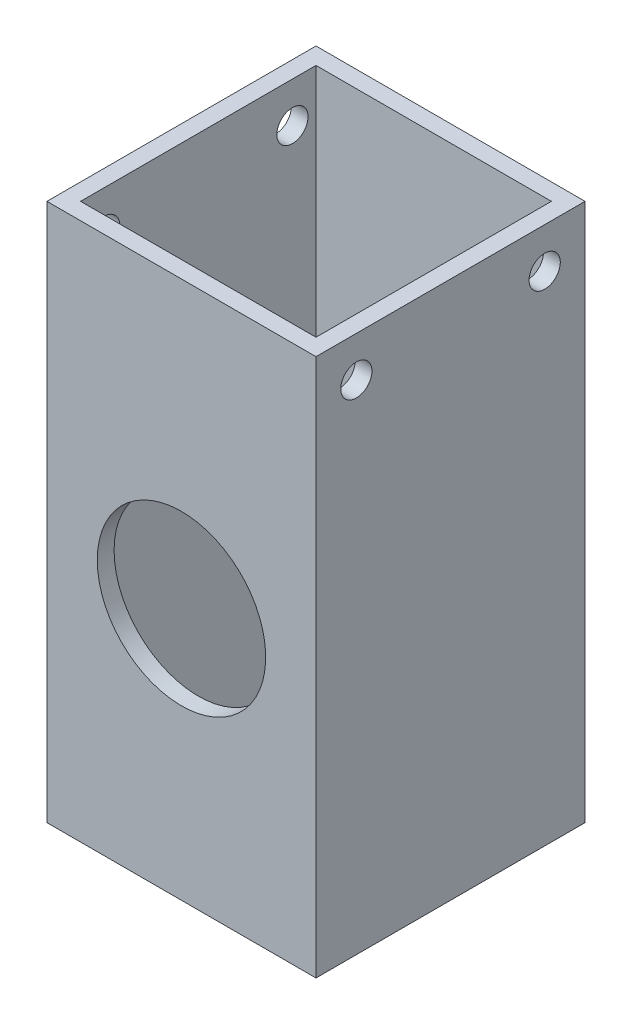
ISO-10303-21;
HEADER;
FILE_DESCRIPTION(('STEP AP214'),'2;1');
FILE_NAME('part.step','',(''),(''),'','','');
FILE_SCHEMA(('AUTOMOTIVE_DESIGN { 1 0 10303 214 1 1 1 1 }'));
ENDSEC;
DATA;
#1=APPLICATION_CONTEXT('core data for automotive mechanical design processes');
#2=APPLICATION_PROTOCOL_DEFINITION('international standard','automotive_design',2000,#1);
#3=PRODUCT_CONTEXT('',#1,'mechanical');
#4=PRODUCT('Part','Part','',(#3));
#5=PRODUCT_RELATED_PRODUCT_CATEGORY('part','',(#4));
#6=PRODUCT_DEFINITION_FORMATION('','',#4);
#7=PRODUCT_DEFINITION_CONTEXT('part definition',#1,'design');
#8=PRODUCT_DEFINITION('design','',#6,#7);
#9=PRODUCT_DEFINITION_SHAPE('','',#8);
#10=(LENGTH_UNIT() NAMED_UNIT(*) SI_UNIT(.MILLI.,.METRE.));
#11=(NAMED_UNIT(*) PLANE_ANGLE_UNIT() SI_UNIT($,.RADIAN.));
#12=(NAMED_UNIT(*) SI_UNIT($,.STERADIAN.) SOLID_ANGLE_UNIT());
#13=UNCERTAINTY_MEASURE_WITH_UNIT(LENGTH_MEASURE(1.E-05),#10,'distance_accuracy_value','');
#14=(GEOMETRIC_REPRESENTATION_CONTEXT(3) GLOBAL_UNCERTAINTY_ASSIGNED_CONTEXT((#13)) GLOBAL_UNIT_ASSIGNED_CONTEXT((#10,
#11,#12)) REPRESENTATION_CONTEXT('',''));
#15=CARTESIAN_POINT('',(0.,0.,0.));
#16=DIRECTION('',(0.,0.,1.));
#17=DIRECTION('',(1.,0.,0.));
#18=AXIS2_PLACEMENT_3D('',#15,#16,#17);
#19=CARTESIAN_POINT('',(0.,50.8,0.));
#20=DIRECTION('',(0.,1.,0.));
#21=DIRECTION('',(0.,0.,1.));
#22=AXIS2_PLACEMENT_3D('',#19,#20,#21);
#23=PLANE('',#22);
#24=DIRECTION('',(0.,0.,-1.));
#25=VECTOR('',#24,1.);
#26=CARTESIAN_POINT('',(12.7,50.8,12.7));
#27=LINE('',#26,#25);
#28=CARTESIAN_POINT('',(12.7,50.8,12.7));
#29=VERTEX_POINT('',#28);
#30=CARTESIAN_POINT('',(12.7,50.8,-12.7));
#31=VERTEX_POINT('',#30);
#32=EDGE_CURVE('E144',#29,#31,#27,.T.);
#33=ORIENTED_EDGE('',*,*,#32,.T.);
#34=DIRECTION('',(-1.,0.,0.));
#35=VECTOR('',#34,1.);
#36=CARTESIAN_POINT('',(12.7,50.8,-12.7));
#37=LINE('',#36,#35);
#38=CARTESIAN_POINT('',(-12.7,50.8,-12.7));
#39=VERTEX_POINT('',#38);
#40=EDGE_CURVE('E147',#31,#39,#37,.T.);
#41=ORIENTED_EDGE('',*,*,#40,.T.);
#42=DIRECTION('',(0.,0.,1.));
#43=VECTOR('',#42,1.);
#44=CARTESIAN_POINT('',(-12.7,50.8,-12.7));
#45=LINE('',#44,#43);
#46=CARTESIAN_POINT('',(-12.7,50.8,12.7));
#47=VERTEX_POINT('',#46);
#48=EDGE_CURVE('E150',#39,#47,#45,.T.);
#49=ORIENTED_EDGE('',*,*,#48,.T.);
#50=DIRECTION('',(1.,0.,0.));
#51=VECTOR('',#50,1.);
#52=CARTESIAN_POINT('',(-12.7,50.8,12.7));
#53=LINE('',#52,#51);
#54=EDGE_CURVE('E152',#47,#29,#53,.T.);
#55=ORIENTED_EDGE('',*,*,#54,.T.);
#56=EDGE_LOOP('',(#33,#41,#49,#55));
#57=FACE_BOUND('',#56,.T.);
#58=DIRECTION('',(-1.,0.,0.));
#59=VECTOR('',#58,1.);
#60=CARTESIAN_POINT('',(11.1125,50.8,-11.1125));
#61=LINE('',#60,#59);
#62=CARTESIAN_POINT('',(11.1125,50.8,-11.1125));
#63=VERTEX_POINT('',#62);
#64=CARTESIAN_POINT('',(-11.1125,50.8,-11.1125));
#65=VERTEX_POINT('',#64);
#66=EDGE_CURVE('E114',#63,#65,#61,.T.);
#67=ORIENTED_EDGE('',*,*,#66,.F.);
#68=DIRECTION('',(0.,0.,-1.));
#69=VECTOR('',#68,1.);
#70=CARTESIAN_POINT('',(11.1125,50.8,11.1125));
#71=LINE('',#70,#69);
#72=CARTESIAN_POINT('',(11.1125,50.8,11.1125));
#73=VERTEX_POINT('',#72);
#74=EDGE_CURVE('E106',#73,#63,#71,.T.);
#75=ORIENTED_EDGE('',*,*,#74,.F.);
#76=DIRECTION('',(1.,0.,0.));
#77=VECTOR('',#76,1.);
#78=CARTESIAN_POINT('',(-11.1125,50.8,11.1125));
#79=LINE('',#78,#77);
#80=CARTESIAN_POINT('',(-11.1125,50.8,11.1125));
#81=VERTEX_POINT('',#80);
#82=EDGE_CURVE('E128',#81,#73,#79,.T.);
#83=ORIENTED_EDGE('',*,*,#82,.F.);
#84=DIRECTION('',(0.,0.,1.));
#85=VECTOR('',#84,1.);
#86=CARTESIAN_POINT('',(-11.1125,50.8,-11.1125));
#87=LINE('',#86,#85);
#88=EDGE_CURVE('E126',#65,#81,#87,.T.);
#89=ORIENTED_EDGE('',*,*,#88,.F.);
#90=EDGE_LOOP('',(#67,#75,#83,#89));
#91=FACE_BOUND('',#90,.T.);
#92=ADVANCED_FACE('F39',(#57,#91),#23,.T.);
#93=CARTESIAN_POINT('',(0.,0.,0.));
#94=DIRECTION('',(0.,1.,0.));
#95=DIRECTION('',(0.,0.,1.));
#96=AXIS2_PLACEMENT_3D('',#93,#94,#95);
#97=PLANE('',#96);
#98=DIRECTION('',(0.,0.,-1.));
#99=VECTOR('',#98,1.);
#100=CARTESIAN_POINT('',(12.7,0.,12.7));
#101=LINE('',#100,#99);
#102=CARTESIAN_POINT('',(12.7,0.,12.7));
#103=VERTEX_POINT('',#102);
#104=CARTESIAN_POINT('',(12.7,0.,-12.7));
#105=VERTEX_POINT('',#104);
#106=EDGE_CURVE('E122',#103,#105,#101,.T.);
#107=ORIENTED_EDGE('',*,*,#106,.F.);
#108=DIRECTION('',(1.,0.,0.));
#109=VECTOR('',#108,1.);
#110=CARTESIAN_POINT('',(-12.7,0.,12.7));
#111=LINE('',#110,#109);
#112=CARTESIAN_POINT('',(-12.7,0.,12.7));
#113=VERTEX_POINT('',#112);
#114=EDGE_CURVE('E148',#113,#103,#111,.T.);
#115=ORIENTED_EDGE('',*,*,#114,.F.);
#116=DIRECTION('',(0.,0.,1.));
#117=VECTOR('',#116,1.);
#118=CARTESIAN_POINT('',(-12.7,0.,-12.7));
#119=LINE('',#118,#117);
#120=CARTESIAN_POINT('',(-12.7,0.,-12.7));
#121=VERTEX_POINT('',#120);
#122=EDGE_CURVE('E159',#121,#113,#119,.T.);
#123=ORIENTED_EDGE('',*,*,#122,.F.);
#124=DIRECTION('',(-1.,0.,0.));
#125=VECTOR('',#124,1.);
#126=CARTESIAN_POINT('',(12.7,0.,-12.7));
#127=LINE('',#126,#125);
#128=EDGE_CURVE('E157',#105,#121,#127,.T.);
#129=ORIENTED_EDGE('',*,*,#128,.F.);
#130=EDGE_LOOP('',(#107,#115,#123,#129));
#131=FACE_BOUND('',#130,.T.);
#132=DIRECTION('',(0.,0.,-1.));
#133=VECTOR('',#132,1.);
#134=CARTESIAN_POINT('',(11.1125,0.,11.1125));
#135=LINE('',#134,#133);
#136=CARTESIAN_POINT('',(11.1125,0.,11.1125));
#137=VERTEX_POINT('',#136);
#138=CARTESIAN_POINT('',(11.1125,0.,-11.1125));
#139=VERTEX_POINT('',#138);
#140=EDGE_CURVE('E64',#137,#139,#135,.T.);
#141=ORIENTED_EDGE('',*,*,#140,.T.);
#142=DIRECTION('',(-1.,0.,0.));
#143=VECTOR('',#142,1.);
#144=CARTESIAN_POINT('',(11.1125,0.,-11.1125));
#145=LINE('',#144,#143);
#146=CARTESIAN_POINT('',(-11.1125,0.,-11.1125));
#147=VERTEX_POINT('',#146);
#148=EDGE_CURVE('E121',#139,#147,#145,.T.);
#149=ORIENTED_EDGE('',*,*,#148,.T.);
#150=DIRECTION('',(0.,0.,1.));
#151=VECTOR('',#150,1.);
#152=CARTESIAN_POINT('',(-11.1125,0.,-11.1125));
#153=LINE('',#152,#151);
#154=CARTESIAN_POINT('',(-11.1125,0.,11.1125));
#155=VERTEX_POINT('',#154);
#156=EDGE_CURVE('E136',#147,#155,#153,.T.);
#157=ORIENTED_EDGE('',*,*,#156,.T.);
#158=DIRECTION('',(1.,0.,0.));
#159=VECTOR('',#158,1.);
#160=CARTESIAN_POINT('',(-11.1125,0.,11.1125));
#161=LINE('',#160,#159);
#162=EDGE_CURVE('E115',#155,#137,#161,.T.);
#163=ORIENTED_EDGE('',*,*,#162,.T.);
#164=EDGE_LOOP('',(#141,#149,#157,#163));
#165=FACE_BOUND('',#164,.T.);
#166=ADVANCED_FACE('F224',(#131,#165),#97,.F.);
#167=CARTESIAN_POINT('',(12.7,50.8,12.7));
#168=DIRECTION('',(-1.,0.,0.));
#169=DIRECTION('',(0.,0.,1.));
#170=AXIS2_PLACEMENT_3D('',#167,#168,#169);
#171=PLANE('',#170);
#172=CARTESIAN_POINT('',(12.7,46.99,8.89));
#173=DIRECTION('',(-1.,0.,0.));
#174=DIRECTION('',(0.,0.,1.));
#175=AXIS2_PLACEMENT_3D('',#172,#173,#174);
#176=CIRCLE('',#175,1.4732);
#177=CARTESIAN_POINT('',(12.7,46.99,10.3632));
#178=VERTEX_POINT('',#177);
#179=EDGE_CURVE('E195',#178,#178,#176,.T.);
#180=ORIENTED_EDGE('',*,*,#179,.T.);
#181=EDGE_LOOP('',(#180));
#182=FACE_BOUND('',#181,.T.);
#183=CARTESIAN_POINT('',(12.7,46.99,-8.89000000000001));
#184=DIRECTION('',(-1.,0.,0.));
#185=DIRECTION('',(0.,0.,1.));
#186=AXIS2_PLACEMENT_3D('',#183,#184,#185);
#187=CIRCLE('',#186,1.4732);
#188=CARTESIAN_POINT('',(12.7,46.99,-7.41680000000001));
#189=VERTEX_POINT('',#188);
#190=EDGE_CURVE('E180',#189,#189,#187,.T.);
#191=ORIENTED_EDGE('',*,*,#190,.T.);
#192=EDGE_LOOP('',(#191));
#193=FACE_BOUND('',#192,.T.);
#194=ORIENTED_EDGE('',*,*,#106,.T.);
#195=DIRECTION('',(0.,-1.,0.));
#196=VECTOR('',#195,1.);
#197=CARTESIAN_POINT('',(12.7,50.8,-12.7));
#198=LINE('',#197,#196);
#199=EDGE_CURVE('E11',#31,#105,#198,.T.);
#200=ORIENTED_EDGE('',*,*,#199,.F.);
#201=ORIENTED_EDGE('',*,*,#32,.F.);
#202=DIRECTION('',(0.,-1.,0.));
#203=VECTOR('',#202,1.);
#204=CARTESIAN_POINT('',(12.7,50.8,12.7));
#205=LINE('',#204,#203);
#206=EDGE_CURVE('E154',#29,#103,#205,.T.);
#207=ORIENTED_EDGE('',*,*,#206,.T.);
#208=EDGE_LOOP('',(#194,#200,#201,#207));
#209=FACE_BOUND('',#208,.T.);
#210=ADVANCED_FACE('F41',(#182,#193,#209),#171,.F.);
#211=CARTESIAN_POINT('',(12.7,50.8,-12.7));
#212=DIRECTION('',(0.,0.,1.));
#213=DIRECTION('',(1.,0.,0.));
#214=AXIS2_PLACEMENT_3D('',#211,#212,#213);
#215=PLANE('',#214);
#216=CARTESIAN_POINT('',(0.,23.8506,-12.7));
#217=DIRECTION('',(0.,0.,1.));
#218=DIRECTION('',(1.,0.,0.));
#219=AXIS2_PLACEMENT_3D('',#216,#217,#218);
#220=CIRCLE('',#219,7.9502);
#221=CARTESIAN_POINT('',(7.9502,23.8506,-12.7));
#222=VERTEX_POINT('',#221);
#223=EDGE_CURVE('E172',#222,#222,#220,.T.);
#224=ORIENTED_EDGE('',*,*,#223,.T.);
#225=EDGE_LOOP('',(#224));
#226=FACE_BOUND('',#225,.T.);
#227=ORIENTED_EDGE('',*,*,#128,.T.);
#228=DIRECTION('',(0.,-1.,0.));
#229=VECTOR('',#228,1.);
#230=CARTESIAN_POINT('',(-12.7,50.8,-12.7));
#231=LINE('',#230,#229);
#232=EDGE_CURVE('E48',#39,#121,#231,.T.);
#233=ORIENTED_EDGE('',*,*,#232,.F.);
#234=ORIENTED_EDGE('',*,*,#40,.F.);
#235=ORIENTED_EDGE('',*,*,#199,.T.);
#236=EDGE_LOOP('',(#227,#233,#234,#235));
#237=FACE_BOUND('',#236,.T.);
#238=ADVANCED_FACE('F239',(#226,#237),#215,.F.);
#239=CARTESIAN_POINT('',(-12.7,50.8,-12.7));
#240=DIRECTION('',(1.,0.,0.));
#241=DIRECTION('',(0.,0.,-1.));
#242=AXIS2_PLACEMENT_3D('',#239,#240,#241);
#243=PLANE('',#242);
#244=CARTESIAN_POINT('',(-12.7,46.99,8.89000000000001));
#245=DIRECTION('',(1.,0.,0.));
#246=DIRECTION('',(0.,0.,-1.));
#247=AXIS2_PLACEMENT_3D('',#244,#245,#246);
#248=CIRCLE('',#247,1.4732);
#249=CARTESIAN_POINT('',(-12.7,46.99,7.41680000000001));
#250=VERTEX_POINT('',#249);
#251=EDGE_CURVE('E176',#250,#250,#248,.T.);
#252=ORIENTED_EDGE('',*,*,#251,.T.);
#253=EDGE_LOOP('',(#252));
#254=FACE_BOUND('',#253,.T.);
#255=CARTESIAN_POINT('',(-12.7,46.99,-8.89));
#256=DIRECTION('',(1.,0.,0.));
#257=DIRECTION('',(0.,0.,1.));
#258=AXIS2_PLACEMENT_3D('',#255,#256,#257);
#259=CIRCLE('',#258,1.4732);
#260=CARTESIAN_POINT('',(-12.7,46.99,-7.4168));
#261=VERTEX_POINT('',#260);
#262=EDGE_CURVE('E183',#261,#261,#259,.T.);
#263=ORIENTED_EDGE('',*,*,#262,.T.);
#264=EDGE_LOOP('',(#263));
#265=FACE_BOUND('',#264,.T.);
#266=ORIENTED_EDGE('',*,*,#122,.T.);
#267=DIRECTION('',(0.,-1.,0.));
#268=VECTOR('',#267,1.);
#269=CARTESIAN_POINT('',(-12.7,50.8,12.7));
#270=LINE('',#269,#268);
#271=EDGE_CURVE('E164',#47,#113,#270,.T.);
#272=ORIENTED_EDGE('',*,*,#271,.F.);
#273=ORIENTED_EDGE('',*,*,#48,.F.);
#274=ORIENTED_EDGE('',*,*,#232,.T.);
#275=EDGE_LOOP('',(#266,#272,#273,#274));
#276=FACE_BOUND('',#275,.T.);
#277=ADVANCED_FACE('F237',(#254,#265,#276),#243,.F.);
#278=CARTESIAN_POINT('',(-12.7,50.8,12.7));
#279=DIRECTION('',(0.,0.,-1.));
#280=DIRECTION('',(-1.,0.,0.));
#281=AXIS2_PLACEMENT_3D('',#278,#279,#280);
#282=PLANE('',#281);
#283=CARTESIAN_POINT('',(0.,23.8506,12.7));
#284=DIRECTION('',(0.,0.,-1.));
#285=DIRECTION('',(-1.,0.,0.));
#286=AXIS2_PLACEMENT_3D('',#283,#284,#285);
#287=CIRCLE('',#286,7.9502);
#288=CARTESIAN_POINT('',(-7.9502,23.8506,12.7));
#289=VERTEX_POINT('',#288);
#290=EDGE_CURVE('E134',#289,#289,#287,.T.);
#291=ORIENTED_EDGE('',*,*,#290,.T.);
#292=EDGE_LOOP('',(#291));
#293=FACE_BOUND('',#292,.T.);
#294=ORIENTED_EDGE('',*,*,#114,.T.);
#295=ORIENTED_EDGE('',*,*,#206,.F.);
#296=ORIENTED_EDGE('',*,*,#54,.F.);
#297=ORIENTED_EDGE('',*,*,#271,.T.);
#298=EDGE_LOOP('',(#294,#295,#296,#297));
#299=FACE_BOUND('',#298,.T.);
#300=ADVANCED_FACE('F204',(#293,#299),#282,.F.);
#301=CARTESIAN_POINT('',(11.1125,50.8,11.1125));
#302=DIRECTION('',(-1.,0.,0.));
#303=DIRECTION('',(0.,0.,1.));
#304=AXIS2_PLACEMENT_3D('',#301,#302,#303);
#305=PLANE('',#304);
#306=CARTESIAN_POINT('',(11.1125,46.99,8.89));
#307=DIRECTION('',(-1.,0.,0.));
#308=DIRECTION('',(0.,0.,1.));
#309=AXIS2_PLACEMENT_3D('',#306,#307,#308);
#310=CIRCLE('',#309,1.4732);
#311=CARTESIAN_POINT('',(11.1125,46.99,10.3632));
#312=VERTEX_POINT('',#311);
#313=EDGE_CURVE('E192',#312,#312,#310,.T.);
#314=ORIENTED_EDGE('',*,*,#313,.F.);
#315=EDGE_LOOP('',(#314));
#316=FACE_BOUND('',#315,.T.);
#317=CARTESIAN_POINT('',(11.1125,46.99,-8.89000000000001));
#318=DIRECTION('',(-1.,0.,0.));
#319=DIRECTION('',(0.,0.,1.));
#320=AXIS2_PLACEMENT_3D('',#317,#318,#319);
#321=CIRCLE('',#320,1.4732);
#322=CARTESIAN_POINT('',(11.1125,46.99,-7.41680000000001));
#323=VERTEX_POINT('',#322);
#324=EDGE_CURVE('E175',#323,#323,#321,.T.);
#325=ORIENTED_EDGE('',*,*,#324,.F.);
#326=EDGE_LOOP('',(#325));
#327=FACE_BOUND('',#326,.T.);
#328=ORIENTED_EDGE('',*,*,#140,.F.);
#329=DIRECTION('',(0.,-1.,0.));
#330=VECTOR('',#329,1.);
#331=CARTESIAN_POINT('',(11.1125,50.8,11.1125));
#332=LINE('',#331,#330);
#333=EDGE_CURVE('E110',#73,#137,#332,.T.);
#334=ORIENTED_EDGE('',*,*,#333,.F.);
#335=ORIENTED_EDGE('',*,*,#74,.T.);
#336=DIRECTION('',(0.,-1.,0.));
#337=VECTOR('',#336,1.);
#338=CARTESIAN_POINT('',(11.1125,50.8,-11.1125));
#339=LINE('',#338,#337);
#340=EDGE_CURVE('E109',#63,#139,#339,.T.);
#341=ORIENTED_EDGE('',*,*,#340,.T.);
#342=EDGE_LOOP('',(#328,#334,#335,#341));
#343=FACE_BOUND('',#342,.T.);
#344=ADVANCED_FACE('F108',(#316,#327,#343),#305,.T.);
#345=CARTESIAN_POINT('',(11.1125,50.8,-11.1125));
#346=DIRECTION('',(0.,0.,1.));
#347=DIRECTION('',(1.,0.,0.));
#348=AXIS2_PLACEMENT_3D('',#345,#346,#347);
#349=PLANE('',#348);
#350=CARTESIAN_POINT('',(0.,23.8506,-11.1125));
#351=DIRECTION('',(0.,0.,1.));
#352=DIRECTION('',(1.,0.,0.));
#353=AXIS2_PLACEMENT_3D('',#350,#351,#352);
#354=CIRCLE('',#353,7.9502);
#355=CARTESIAN_POINT('',(7.9502,23.8506,-11.1125));
#356=VERTEX_POINT('',#355);
#357=EDGE_CURVE('E171',#356,#356,#354,.T.);
#358=ORIENTED_EDGE('',*,*,#357,.F.);
#359=EDGE_LOOP('',(#358));
#360=FACE_BOUND('',#359,.T.);
#361=ORIENTED_EDGE('',*,*,#148,.F.);
#362=ORIENTED_EDGE('',*,*,#340,.F.);
#363=ORIENTED_EDGE('',*,*,#66,.T.);
#364=DIRECTION('',(0.,-1.,0.));
#365=VECTOR('',#364,1.);
#366=CARTESIAN_POINT('',(-11.1125,50.8,-11.1125));
#367=LINE('',#366,#365);
#368=EDGE_CURVE('E123',#65,#147,#367,.T.);
#369=ORIENTED_EDGE('',*,*,#368,.T.);
#370=EDGE_LOOP('',(#361,#362,#363,#369));
#371=FACE_BOUND('',#370,.T.);
#372=ADVANCED_FACE('F118',(#360,#371),#349,.T.);
#373=CARTESIAN_POINT('',(-11.1125,50.8,-11.1125));
#374=DIRECTION('',(1.,0.,0.));
#375=DIRECTION('',(0.,0.,-1.));
#376=AXIS2_PLACEMENT_3D('',#373,#374,#375);
#377=PLANE('',#376);
#378=CARTESIAN_POINT('',(-11.1125,46.99,8.89000000000001));
#379=DIRECTION('',(1.,0.,0.));
#380=DIRECTION('',(0.,0.,-1.));
#381=AXIS2_PLACEMENT_3D('',#378,#379,#380);
#382=CIRCLE('',#381,1.4732);
#383=CARTESIAN_POINT('',(-11.1125,46.99,7.41680000000001));
#384=VERTEX_POINT('',#383);
#385=EDGE_CURVE('E43',#384,#384,#382,.T.);
#386=ORIENTED_EDGE('',*,*,#385,.F.);
#387=EDGE_LOOP('',(#386));
#388=FACE_BOUND('',#387,.T.);
#389=CARTESIAN_POINT('',(-11.1125,46.99,-8.89));
#390=DIRECTION('',(1.,0.,0.));
#391=DIRECTION('',(0.,0.,-1.));
#392=AXIS2_PLACEMENT_3D('',#389,#390,#391);
#393=CIRCLE('',#392,1.4732);
#394=CARTESIAN_POINT('',(-11.1125,46.99,-10.3632));
#395=VERTEX_POINT('',#394);
#396=EDGE_CURVE('E173',#395,#395,#393,.T.);
#397=ORIENTED_EDGE('',*,*,#396,.F.);
#398=EDGE_LOOP('',(#397));
#399=FACE_BOUND('',#398,.T.);
#400=ORIENTED_EDGE('',*,*,#156,.F.);
#401=ORIENTED_EDGE('',*,*,#368,.F.);
#402=ORIENTED_EDGE('',*,*,#88,.T.);
#403=DIRECTION('',(0.,-1.,0.));
#404=VECTOR('',#403,1.);
#405=CARTESIAN_POINT('',(-11.1125,50.8,11.1125));
#406=LINE('',#405,#404);
#407=EDGE_CURVE('E56',#81,#155,#406,.T.);
#408=ORIENTED_EDGE('',*,*,#407,.T.);
#409=EDGE_LOOP('',(#400,#401,#402,#408));
#410=FACE_BOUND('',#409,.T.);
#411=ADVANCED_FACE('F219',(#388,#399,#410),#377,.T.);
#412=CARTESIAN_POINT('',(-11.1125,50.8,11.1125));
#413=DIRECTION('',(0.,0.,-1.));
#414=DIRECTION('',(-1.,0.,0.));
#415=AXIS2_PLACEMENT_3D('',#412,#413,#414);
#416=PLANE('',#415);
#417=CARTESIAN_POINT('',(0.,23.8506,11.1125));
#418=DIRECTION('',(0.,0.,-1.));
#419=DIRECTION('',(-1.,0.,0.));
#420=AXIS2_PLACEMENT_3D('',#417,#418,#419);
#421=CIRCLE('',#420,7.9502);
#422=CARTESIAN_POINT('',(-7.9502,23.8506,11.1125));
#423=VERTEX_POINT('',#422);
#424=EDGE_CURVE('E169',#423,#423,#421,.T.);
#425=ORIENTED_EDGE('',*,*,#424,.F.);
#426=EDGE_LOOP('',(#425));
#427=FACE_BOUND('',#426,.T.);
#428=ORIENTED_EDGE('',*,*,#162,.F.);
#429=ORIENTED_EDGE('',*,*,#407,.F.);
#430=ORIENTED_EDGE('',*,*,#82,.T.);
#431=ORIENTED_EDGE('',*,*,#333,.T.);
#432=EDGE_LOOP('',(#428,#429,#430,#431));
#433=FACE_BOUND('',#432,.T.);
#434=ADVANCED_FACE('F210',(#427,#433),#416,.T.);
#435=CARTESIAN_POINT('',(0.,23.8506,-12.7));
#436=DIRECTION('',(0.,0.,1.));
#437=DIRECTION('',(1.,0.,0.));
#438=AXIS2_PLACEMENT_3D('',#435,#436,#437);
#439=CYLINDRICAL_SURFACE('',#438,7.9502);
#440=ORIENTED_EDGE('',*,*,#424,.T.);
#441=EDGE_LOOP('',(#440));
#442=FACE_BOUND('',#441,.T.);
#443=ORIENTED_EDGE('',*,*,#290,.F.);
#444=EDGE_LOOP('',(#443));
#445=FACE_BOUND('',#444,.T.);
#446=ADVANCED_FACE('F207',(#442,#445),#439,.F.);
#447=ORIENTED_EDGE('',*,*,#357,.T.);
#448=EDGE_LOOP('',(#447));
#449=FACE_BOUND('',#448,.T.);
#450=ORIENTED_EDGE('',*,*,#223,.F.);
#451=EDGE_LOOP('',(#450));
#452=FACE_BOUND('',#451,.T.);
#453=ADVANCED_FACE('F209',(#449,#452),#439,.F.);
#454=CARTESIAN_POINT('',(-12.7,46.99,-8.89));
#455=DIRECTION('',(1.,0.,0.));
#456=DIRECTION('',(0.,0.,-1.));
#457=AXIS2_PLACEMENT_3D('',#454,#455,#456);
#458=CYLINDRICAL_SURFACE('',#457,1.4732);
#459=ORIENTED_EDGE('',*,*,#396,.T.);
#460=EDGE_LOOP('',(#459));
#461=FACE_BOUND('',#460,.T.);
#462=ORIENTED_EDGE('',*,*,#262,.F.);
#463=EDGE_LOOP('',(#462));
#464=FACE_BOUND('',#463,.T.);
#465=ADVANCED_FACE('F217',(#461,#464),#458,.F.);
#466=CARTESIAN_POINT('',(-12.7,46.99,8.89000000000001));
#467=DIRECTION('',(1.,0.,0.));
#468=DIRECTION('',(0.,0.,-1.));
#469=AXIS2_PLACEMENT_3D('',#466,#467,#468);
#470=CYLINDRICAL_SURFACE('',#469,1.4732);
#471=ORIENTED_EDGE('',*,*,#385,.T.);
#472=EDGE_LOOP('',(#471));
#473=FACE_BOUND('',#472,.T.);
#474=ORIENTED_EDGE('',*,*,#251,.F.);
#475=EDGE_LOOP('',(#474));
#476=FACE_BOUND('',#475,.T.);
#477=ADVANCED_FACE('F276',(#473,#476),#470,.F.);
#478=ORIENTED_EDGE('',*,*,#324,.T.);
#479=EDGE_LOOP('',(#478));
#480=FACE_BOUND('',#479,.T.);
#481=ORIENTED_EDGE('',*,*,#190,.F.);
#482=EDGE_LOOP('',(#481));
#483=FACE_BOUND('',#482,.T.);
#484=ADVANCED_FACE('F279',(#480,#483),#458,.F.);
#485=ORIENTED_EDGE('',*,*,#313,.T.);
#486=EDGE_LOOP('',(#485));
#487=FACE_BOUND('',#486,.T.);
#488=ORIENTED_EDGE('',*,*,#179,.F.);
#489=EDGE_LOOP('',(#488));
#490=FACE_BOUND('',#489,.T.);
#491=ADVANCED_FACE('F281',(#487,#490),#470,.F.);
#492=CLOSED_SHELL('',(#92,#166,#210,#238,#277,#300,#344,#372,#411,#434,#446,#453,#465,#477,#484,#491));
#493=MANIFOLD_SOLID_BREP('B2',#492);
#494=ADVANCED_BREP_SHAPE_REPRESENTATION('',(#18,#493),#14);
#495=SHAPE_DEFINITION_REPRESENTATION(#9,#494);
ENDSEC;
END-ISO-10303-21;
